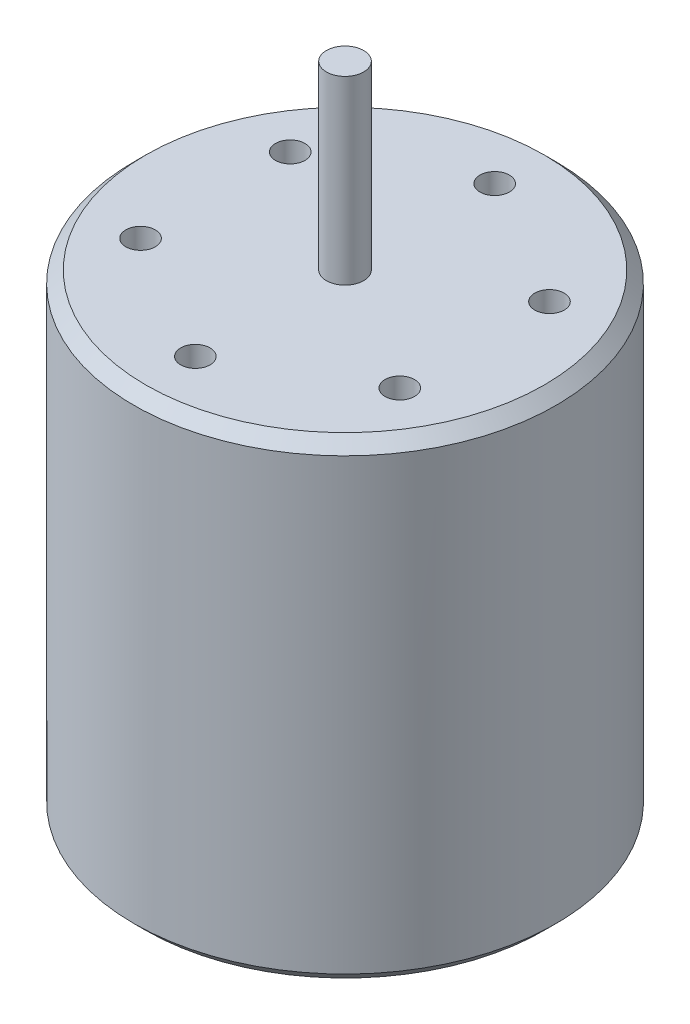
ISO-10303-21;
HEADER;
FILE_DESCRIPTION(('STEP AP214'),'2;1');
FILE_NAME('part.step','',(''),(''),'','','');
FILE_SCHEMA(('AUTOMOTIVE_DESIGN { 1 0 10303 214 1 1 1 1 }'));
ENDSEC;
DATA;
#1=APPLICATION_CONTEXT('core data for automotive mechanical design processes');
#2=APPLICATION_PROTOCOL_DEFINITION('international standard','automotive_design',2000,#1);
#3=PRODUCT_CONTEXT('',#1,'mechanical');
#4=PRODUCT('Part','Part','',(#3));
#5=PRODUCT_RELATED_PRODUCT_CATEGORY('part','',(#4));
#6=PRODUCT_DEFINITION_FORMATION('','',#4);
#7=PRODUCT_DEFINITION_CONTEXT('part definition',#1,'design');
#8=PRODUCT_DEFINITION('design','',#6,#7);
#9=PRODUCT_DEFINITION_SHAPE('','',#8);
#10=(LENGTH_UNIT() NAMED_UNIT(*) SI_UNIT(.MILLI.,.METRE.));
#11=(NAMED_UNIT(*) PLANE_ANGLE_UNIT() SI_UNIT($,.RADIAN.));
#12=(NAMED_UNIT(*) SI_UNIT($,.STERADIAN.) SOLID_ANGLE_UNIT());
#13=UNCERTAINTY_MEASURE_WITH_UNIT(LENGTH_MEASURE(1.E-05),#10,'distance_accuracy_value','');
#14=(GEOMETRIC_REPRESENTATION_CONTEXT(3) GLOBAL_UNCERTAINTY_ASSIGNED_CONTEXT((#13)) GLOBAL_UNIT_ASSIGNED_CONTEXT((#10,
#11,#12)) REPRESENTATION_CONTEXT('',''));
#15=CARTESIAN_POINT('',(0.,0.,0.));
#16=DIRECTION('',(0.,0.,1.));
#17=DIRECTION('',(1.,0.,0.));
#18=AXIS2_PLACEMENT_3D('',#15,#16,#17);
#19=CARTESIAN_POINT('',(0.,40.0812,0.));
#20=DIRECTION('',(0.,1.,0.));
#21=DIRECTION('',(0.,0.,1.));
#22=AXIS2_PLACEMENT_3D('',#19,#20,#21);
#23=PLANE('',#22);
#24=CARTESIAN_POINT('',(0.,40.0812,0.));
#25=DIRECTION('',(0.,1.,0.));
#26=DIRECTION('',(0.,0.,1.));
#27=AXIS2_PLACEMENT_3D('',#24,#25,#26);
#28=CIRCLE('',#27,16.907);
#29=CARTESIAN_POINT('',(0.,40.0812,16.907));
#30=VERTEX_POINT('',#29);
#31=EDGE_CURVE('E113',#30,#30,#28,.T.);
#32=ORIENTED_EDGE('',*,*,#31,.T.);
#33=EDGE_LOOP('',(#32));
#34=FACE_BOUND('',#33,.T.);
#35=CARTESIAN_POINT('',(-10.998522628062,40.0812,-6.34999999999938));
#36=DIRECTION('',(0.,1.,0.));
#37=DIRECTION('',(0.,0.,1.));
#38=AXIS2_PLACEMENT_3D('',#35,#36,#37);
#39=CIRCLE('',#38,1.25);
#40=CARTESIAN_POINT('',(-10.998522628062,40.0812,-5.09999999999938));
#41=VERTEX_POINT('',#40);
#42=EDGE_CURVE('E107',#41,#41,#39,.T.);
#43=ORIENTED_EDGE('',*,*,#42,.F.);
#44=EDGE_LOOP('',(#43));
#45=FACE_BOUND('',#44,.T.);
#46=CARTESIAN_POINT('',(-10.9985226280613,40.0812,6.35000000000063));
#47=DIRECTION('',(0.,1.,0.));
#48=DIRECTION('',(0.,0.,1.));
#49=AXIS2_PLACEMENT_3D('',#46,#47,#48);
#50=CIRCLE('',#49,1.25);
#51=CARTESIAN_POINT('',(-10.9985226280613,40.0812,7.60000000000063));
#52=VERTEX_POINT('',#51);
#53=EDGE_CURVE('E101',#52,#52,#50,.T.);
#54=ORIENTED_EDGE('',*,*,#53,.F.);
#55=EDGE_LOOP('',(#54));
#56=FACE_BOUND('',#55,.T.);
#57=CARTESIAN_POINT('',(1.44071223619469E-12,40.0812,12.7));
#58=DIRECTION('',(0.,1.,0.));
#59=DIRECTION('',(0.,0.,1.));
#60=AXIS2_PLACEMENT_3D('',#57,#58,#59);
#61=CIRCLE('',#60,1.25);
#62=CARTESIAN_POINT('',(1.44071223619469E-12,40.0812,13.95));
#63=VERTEX_POINT('',#62);
#64=EDGE_CURVE('E95',#63,#63,#61,.T.);
#65=ORIENTED_EDGE('',*,*,#64,.F.);
#66=EDGE_LOOP('',(#65));
#67=FACE_BOUND('',#66,.T.);
#68=CARTESIAN_POINT('',(10.9985226280635,40.0812,6.34999999999938));
#69=DIRECTION('',(0.,1.,0.));
#70=DIRECTION('',(0.,0.,1.));
#71=AXIS2_PLACEMENT_3D('',#68,#69,#70);
#72=CIRCLE('',#71,1.25);
#73=CARTESIAN_POINT('',(10.9985226280635,40.0812,7.59999999999937));
#74=VERTEX_POINT('',#73);
#75=EDGE_CURVE('E89',#74,#74,#72,.T.);
#76=ORIENTED_EDGE('',*,*,#75,.F.);
#77=EDGE_LOOP('',(#76));
#78=FACE_BOUND('',#77,.T.);
#79=CARTESIAN_POINT('',(10.9985226280627,40.0812,-6.35000000000062));
#80=DIRECTION('',(0.,1.,0.));
#81=DIRECTION('',(0.,0.,1.));
#82=AXIS2_PLACEMENT_3D('',#79,#80,#81);
#83=CIRCLE('',#82,1.25);
#84=CARTESIAN_POINT('',(10.9985226280627,40.0812,-5.10000000000062));
#85=VERTEX_POINT('',#84);
#86=EDGE_CURVE('E76',#85,#85,#83,.T.);
#87=ORIENTED_EDGE('',*,*,#86,.F.);
#88=EDGE_LOOP('',(#87));
#89=FACE_BOUND('',#88,.T.);
#90=CARTESIAN_POINT('',(0.,40.0812,-12.7));
#91=DIRECTION('',(0.,1.,0.));
#92=DIRECTION('',(0.,0.,1.));
#93=AXIS2_PLACEMENT_3D('',#90,#91,#92);
#94=CIRCLE('',#93,1.25);
#95=CARTESIAN_POINT('',(0.,40.0812,-11.45));
#96=VERTEX_POINT('',#95);
#97=EDGE_CURVE('E77',#96,#96,#94,.T.);
#98=ORIENTED_EDGE('',*,*,#97,.F.);
#99=EDGE_LOOP('',(#98));
#100=FACE_BOUND('',#99,.T.);
#101=CARTESIAN_POINT('',(0.,40.0812,0.));
#102=DIRECTION('',(0.,1.,0.));
#103=DIRECTION('',(0.,0.,1.));
#104=AXIS2_PLACEMENT_3D('',#101,#102,#103);
#105=CIRCLE('',#104,1.58);
#106=CARTESIAN_POINT('',(0.,40.0812,1.58));
#107=VERTEX_POINT('',#106);
#108=EDGE_CURVE('E147',#107,#107,#105,.T.);
#109=ORIENTED_EDGE('',*,*,#108,.F.);
#110=EDGE_LOOP('',(#109));
#111=FACE_BOUND('',#110,.T.);
#112=ADVANCED_FACE('F39',(#34,#45,#56,#67,#78,#89,#100,#111),#23,.T.);
#113=CARTESIAN_POINT('',(0.,40.0812,0.));
#114=DIRECTION('',(0.,-1.,0.));
#115=DIRECTION('',(0.,0.,-1.));
#116=AXIS2_PLACEMENT_3D('',#113,#114,#115);
#117=CYLINDRICAL_SURFACE('',#116,17.907);
#118=CARTESIAN_POINT('',(0.,39.0812,0.));
#119=DIRECTION('',(0.,1.,0.));
#120=DIRECTION('',(0.,0.,1.));
#121=AXIS2_PLACEMENT_3D('',#118,#119,#120);
#122=CIRCLE('',#121,17.907);
#123=CARTESIAN_POINT('',(0.,39.0812,-17.907));
#124=VERTEX_POINT('',#123);
#125=EDGE_CURVE('E47',#124,#124,#122,.F.);
#126=CARTESIAN_POINT('',(0.,1.00000000000003,0.));
#127=DIRECTION('',(0.,1.,0.));
#128=DIRECTION('',(0.,0.,1.));
#129=AXIS2_PLACEMENT_3D('',#126,#127,#128);
#130=CIRCLE('',#129,17.907);
#131=CARTESIAN_POINT('',(0.,1.00000000000002,-17.907));
#132=VERTEX_POINT('',#131);
#133=EDGE_CURVE('E116',#132,#132,#130,.T.);
#134=CARTESIAN_POINT('',(0.,39.0812,-17.907));
#135=CARTESIAN_POINT('',(0.,38.6845208333334,-17.907));
#136=CARTESIAN_POINT('',(0.,38.2878416666667,-17.907));
#137=CARTESIAN_POINT('',(0.,37.4944833333334,-17.907));
#138=CARTESIAN_POINT('',(0.,37.0978041666667,-17.907));
#139=CARTESIAN_POINT('',(0.,36.3044458333334,-17.907));
#140=CARTESIAN_POINT('',(0.,35.9077666666667,-17.907));
#141=CARTESIAN_POINT('',(0.,35.1144083333334,-17.907));
#142=CARTESIAN_POINT('',(0.,34.7177291666667,-17.907));
#143=CARTESIAN_POINT('',(0.,33.9243708333334,-17.907));
#144=CARTESIAN_POINT('',(0.,33.5276916666667,-17.907));
#145=CARTESIAN_POINT('',(0.,32.7343333333334,-17.907));
#146=CARTESIAN_POINT('',(0.,32.3376541666667,-17.907));
#147=CARTESIAN_POINT('',(0.,31.5442958333334,-17.907));
#148=CARTESIAN_POINT('',(0.,31.1476166666667,-17.907));
#149=CARTESIAN_POINT('',(0.,30.3542583333334,-17.907));
#150=CARTESIAN_POINT('',(0.,29.9575791666667,-17.907));
#151=CARTESIAN_POINT('',(0.,29.1642208333334,-17.907));
#152=CARTESIAN_POINT('',(0.,28.7675416666667,-17.907));
#153=CARTESIAN_POINT('',(0.,27.9741833333334,-17.907));
#154=CARTESIAN_POINT('',(0.,27.5775041666667,-17.907));
#155=CARTESIAN_POINT('',(0.,26.7841458333334,-17.907));
#156=CARTESIAN_POINT('',(0.,26.3874666666667,-17.907));
#157=CARTESIAN_POINT('',(0.,25.5941083333334,-17.907));
#158=CARTESIAN_POINT('',(0.,25.1974291666667,-17.907));
#159=CARTESIAN_POINT('',(0.,24.4040708333334,-17.907));
#160=CARTESIAN_POINT('',(0.,24.0073916666667,-17.907));
#161=CARTESIAN_POINT('',(0.,23.2140333333334,-17.907));
#162=CARTESIAN_POINT('',(0.,22.8173541666667,-17.907));
#163=CARTESIAN_POINT('',(0.,22.0239958333334,-17.907));
#164=CARTESIAN_POINT('',(0.,21.6273166666667,-17.907));
#165=CARTESIAN_POINT('',(0.,20.8339583333334,-17.907));
#166=CARTESIAN_POINT('',(0.,20.4372791666667,-17.907));
#167=CARTESIAN_POINT('',(0.,19.6439208333334,-17.907));
#168=CARTESIAN_POINT('',(0.,19.2472416666667,-17.907));
#169=CARTESIAN_POINT('',(0.,18.4538833333334,-17.907));
#170=CARTESIAN_POINT('',(0.,18.0572041666667,-17.907));
#171=CARTESIAN_POINT('',(0.,17.2638458333334,-17.907));
#172=CARTESIAN_POINT('',(0.,16.8671666666667,-17.907));
#173=CARTESIAN_POINT('',(0.,16.0738083333334,-17.907));
#174=CARTESIAN_POINT('',(0.,15.6771291666667,-17.907));
#175=CARTESIAN_POINT('',(0.,14.8837708333334,-17.907));
#176=CARTESIAN_POINT('',(0.,14.4870916666667,-17.907));
#177=CARTESIAN_POINT('',(0.,13.6937333333334,-17.907));
#178=CARTESIAN_POINT('',(0.,13.2970541666667,-17.907));
#179=CARTESIAN_POINT('',(0.,12.5036958333334,-17.907));
#180=CARTESIAN_POINT('',(0.,12.1070166666667,-17.907));
#181=CARTESIAN_POINT('',(0.,11.3136583333334,-17.907));
#182=CARTESIAN_POINT('',(0.,10.9169791666667,-17.907));
#183=CARTESIAN_POINT('',(0.,10.1236208333334,-17.907));
#184=CARTESIAN_POINT('',(0.,9.72694166666669,-17.907));
#185=CARTESIAN_POINT('',(0.,8.93358333333336,-17.907));
#186=CARTESIAN_POINT('',(0.,8.53690416666669,-17.907));
#187=CARTESIAN_POINT('',(0.,7.74354583333336,-17.907));
#188=CARTESIAN_POINT('',(0.,7.34686666666669,-17.907));
#189=CARTESIAN_POINT('',(0.,6.55350833333336,-17.907));
#190=CARTESIAN_POINT('',(0.,6.15682916666669,-17.907));
#191=CARTESIAN_POINT('',(0.,5.36347083333336,-17.907));
#192=CARTESIAN_POINT('',(0.,4.96679166666669,-17.907));
#193=CARTESIAN_POINT('',(0.,4.17343333333336,-17.907));
#194=CARTESIAN_POINT('',(0.,3.77675416666669,-17.907));
#195=CARTESIAN_POINT('',(0.,2.98339583333336,-17.907));
#196=CARTESIAN_POINT('',(0.,2.58671666666669,-17.907));
#197=CARTESIAN_POINT('',(0.,1.79335833333336,-17.907));
#198=CARTESIAN_POINT('',(0.,1.39667916666669,-17.907));
#199=CARTESIAN_POINT('',(0.,1.00000000000002,-17.907));
#200=B_SPLINE_CURVE_WITH_KNOTS('',3,(#134,#135,#136,#137,#138,#139,#140,#141,#142,#143,#144,
#145,#146,#147,#148,#149,#150,#151,#152,#153,#154,#155,#156,#157,#158,#159,#160,#161,#162,#163,
#164,#165,#166,#167,#168,#169,#170,#171,#172,#173,#174,#175,#176,#177,#178,#179,#180,#181,#182,
#183,#184,#185,#186,#187,#188,#189,#190,#191,#192,#193,#194,#195,#196,#197,#198,#199),
.UNSPECIFIED.,.F.,.F.,(4,2,2,2,2,2,2,2,2,2,2,2,2,2,2,2,2,2,2,2,2,2,2,2,2,2,2,2,2,2,2,2,4),(0.,
1.1900375,2.380075,3.57011250000001,4.76015,5.9501875,7.14022500000001,8.33026250000001,9.5203,
10.7103375,11.900375,13.0904125,14.28045,15.4704875,16.660525,17.8505625,19.0406,20.2306375,
21.420675,22.6107125,23.80075,24.9907875,26.180825,27.3708625,28.5609,29.7509375,30.940975,
32.1310125,33.32105,34.5110875,35.701125,36.8911625,38.0812),.UNSPECIFIED.);
#201=EDGE_CURVE('BSEAM121',#124,#132,#200,.T.);
#202=ORIENTED_EDGE('',*,*,#125,.T.);
#203=ORIENTED_EDGE('',*,*,#133,.T.);
#204=ORIENTED_EDGE('',*,*,#201,.T.);
#205=ORIENTED_EDGE('',*,*,#201,.F.);
#206=EDGE_LOOP('',(#202,#204,#203,#205));
#207=FACE_BOUND('',#206,.T.);
#208=ADVANCED_FACE('F121',(#207),#117,.T.);
#209=CARTESIAN_POINT('',(0.,0.,0.));
#210=DIRECTION('',(0.,1.,0.));
#211=DIRECTION('',(0.,0.,1.));
#212=AXIS2_PLACEMENT_3D('',#209,#210,#211);
#213=PLANE('',#212);
#214=CARTESIAN_POINT('',(0.,0.,0.));
#215=DIRECTION('',(0.,1.,0.));
#216=DIRECTION('',(0.,0.,1.));
#217=AXIS2_PLACEMENT_3D('',#214,#215,#216);
#218=CIRCLE('',#217,16.907);
#219=CARTESIAN_POINT('',(0.,0.,16.907));
#220=VERTEX_POINT('',#219);
#221=EDGE_CURVE('E11',#220,#220,#218,.F.);
#222=ORIENTED_EDGE('',*,*,#221,.T.);
#223=EDGE_LOOP('',(#222));
#224=FACE_BOUND('',#223,.T.);
#225=ADVANCED_FACE('F200',(#224),#213,.F.);
#226=CARTESIAN_POINT('',(-10.998522628062,35.0812,-6.34999999999938));
#227=DIRECTION('',(0.,1.,0.));
#228=DIRECTION('',(0.,0.,1.));
#229=AXIS2_PLACEMENT_3D('',#226,#227,#228);
#230=CONICAL_SURFACE('',#229,1.25,1.02974425867665);
#231=CARTESIAN_POINT('',(-10.998522628062,34.3301242262156,-6.34999999999938));
#232=VERTEX_POINT('',#231);
#233=VERTEX_LOOP('',#232);
#234=FACE_BOUND('',#233,.T.);
#235=CARTESIAN_POINT('',(-10.998522628062,35.0812,-6.34999999999938));
#236=DIRECTION('',(0.,1.,0.));
#237=DIRECTION('',(0.,0.,1.));
#238=AXIS2_PLACEMENT_3D('',#235,#236,#237);
#239=CIRCLE('',#238,1.25);
#240=CARTESIAN_POINT('',(-10.998522628062,35.0812,-5.09999999999938));
#241=VERTEX_POINT('',#240);
#242=EDGE_CURVE('E110',#241,#241,#239,.T.);
#243=ORIENTED_EDGE('',*,*,#242,.T.);
#244=EDGE_LOOP('',(#243));
#245=FACE_BOUND('',#244,.T.);
#246=ADVANCED_FACE('F197',(#234,#245),#230,.F.);
#247=CARTESIAN_POINT('',(-10.998522628062,40.0812,-6.34999999999938));
#248=DIRECTION('',(0.,1.,0.));
#249=DIRECTION('',(0.,0.,1.));
#250=AXIS2_PLACEMENT_3D('',#247,#248,#249);
#251=CYLINDRICAL_SURFACE('',#250,1.25);
#252=ORIENTED_EDGE('',*,*,#242,.F.);
#253=EDGE_LOOP('',(#252));
#254=FACE_BOUND('',#253,.T.);
#255=ORIENTED_EDGE('',*,*,#42,.T.);
#256=EDGE_LOOP('',(#255));
#257=FACE_BOUND('',#256,.T.);
#258=ADVANCED_FACE('F194',(#254,#257),#251,.F.);
#259=CARTESIAN_POINT('',(-10.9985226280613,35.0812,6.35000000000063));
#260=DIRECTION('',(0.,1.,0.));
#261=DIRECTION('',(0.,0.,1.));
#262=AXIS2_PLACEMENT_3D('',#259,#260,#261);
#263=CONICAL_SURFACE('',#262,1.25,1.02974425867665);
#264=CARTESIAN_POINT('',(-10.9985226280613,34.3301242262156,6.35000000000063));
#265=VERTEX_POINT('',#264);
#266=VERTEX_LOOP('',#265);
#267=FACE_BOUND('',#266,.T.);
#268=CARTESIAN_POINT('',(-10.9985226280613,35.0812,6.35000000000063));
#269=DIRECTION('',(0.,1.,0.));
#270=DIRECTION('',(0.,0.,1.));
#271=AXIS2_PLACEMENT_3D('',#268,#269,#270);
#272=CIRCLE('',#271,1.25);
#273=CARTESIAN_POINT('',(-10.9985226280613,35.0812,7.60000000000063));
#274=VERTEX_POINT('',#273);
#275=EDGE_CURVE('E104',#274,#274,#272,.T.);
#276=ORIENTED_EDGE('',*,*,#275,.T.);
#277=EDGE_LOOP('',(#276));
#278=FACE_BOUND('',#277,.T.);
#279=ADVANCED_FACE('F190',(#267,#278),#263,.F.);
#280=CARTESIAN_POINT('',(-10.9985226280613,40.0812,6.35000000000063));
#281=DIRECTION('',(0.,1.,0.));
#282=DIRECTION('',(0.,0.,1.));
#283=AXIS2_PLACEMENT_3D('',#280,#281,#282);
#284=CYLINDRICAL_SURFACE('',#283,1.25);
#285=ORIENTED_EDGE('',*,*,#275,.F.);
#286=EDGE_LOOP('',(#285));
#287=FACE_BOUND('',#286,.T.);
#288=ORIENTED_EDGE('',*,*,#53,.T.);
#289=EDGE_LOOP('',(#288));
#290=FACE_BOUND('',#289,.T.);
#291=ADVANCED_FACE('F186',(#287,#290),#284,.F.);
#292=CARTESIAN_POINT('',(1.44071223619469E-12,35.0812,12.7));
#293=DIRECTION('',(0.,1.,0.));
#294=DIRECTION('',(0.,0.,1.));
#295=AXIS2_PLACEMENT_3D('',#292,#293,#294);
#296=CONICAL_SURFACE('',#295,1.25,1.02974425867665);
#297=CARTESIAN_POINT('',(1.43930362888709E-12,34.3301242262156,12.7));
#298=VERTEX_POINT('',#297);
#299=VERTEX_LOOP('',#298);
#300=FACE_BOUND('',#299,.T.);
#301=CARTESIAN_POINT('',(1.44071223619469E-12,35.0812,12.7));
#302=DIRECTION('',(0.,1.,0.));
#303=DIRECTION('',(0.,0.,1.));
#304=AXIS2_PLACEMENT_3D('',#301,#302,#303);
#305=CIRCLE('',#304,1.25);
#306=CARTESIAN_POINT('',(1.44071223619469E-12,35.0812,13.95));
#307=VERTEX_POINT('',#306);
#308=EDGE_CURVE('E98',#307,#307,#305,.T.);
#309=ORIENTED_EDGE('',*,*,#308,.T.);
#310=EDGE_LOOP('',(#309));
#311=FACE_BOUND('',#310,.T.);
#312=ADVANCED_FACE('F182',(#300,#311),#296,.F.);
#313=CARTESIAN_POINT('',(1.44071223619469E-12,40.0812,12.7));
#314=DIRECTION('',(0.,1.,0.));
#315=DIRECTION('',(0.,0.,1.));
#316=AXIS2_PLACEMENT_3D('',#313,#314,#315);
#317=CYLINDRICAL_SURFACE('',#316,1.25);
#318=ORIENTED_EDGE('',*,*,#308,.F.);
#319=EDGE_LOOP('',(#318));
#320=FACE_BOUND('',#319,.T.);
#321=ORIENTED_EDGE('',*,*,#64,.T.);
#322=EDGE_LOOP('',(#321));
#323=FACE_BOUND('',#322,.T.);
#324=ADVANCED_FACE('F178',(#320,#323),#317,.F.);
#325=CARTESIAN_POINT('',(10.9985226280635,35.0812,6.34999999999938));
#326=DIRECTION('',(0.,1.,0.));
#327=DIRECTION('',(0.,0.,1.));
#328=AXIS2_PLACEMENT_3D('',#325,#326,#327);
#329=CONICAL_SURFACE('',#328,1.25,1.02974425867665);
#330=CARTESIAN_POINT('',(10.9985226280634,34.3301242262156,6.34999999999938));
#331=VERTEX_POINT('',#330);
#332=VERTEX_LOOP('',#331);
#333=FACE_BOUND('',#332,.T.);
#334=CARTESIAN_POINT('',(10.9985226280635,35.0812,6.34999999999938));
#335=DIRECTION('',(0.,1.,0.));
#336=DIRECTION('',(0.,0.,1.));
#337=AXIS2_PLACEMENT_3D('',#334,#335,#336);
#338=CIRCLE('',#337,1.25);
#339=CARTESIAN_POINT('',(10.9985226280635,35.0812,7.59999999999937));
#340=VERTEX_POINT('',#339);
#341=EDGE_CURVE('E92',#340,#340,#338,.T.);
#342=ORIENTED_EDGE('',*,*,#341,.T.);
#343=EDGE_LOOP('',(#342));
#344=FACE_BOUND('',#343,.T.);
#345=ADVANCED_FACE('F174',(#333,#344),#329,.F.);
#346=CARTESIAN_POINT('',(10.9985226280635,40.0812,6.34999999999938));
#347=DIRECTION('',(0.,1.,0.));
#348=DIRECTION('',(0.,0.,1.));
#349=AXIS2_PLACEMENT_3D('',#346,#347,#348);
#350=CYLINDRICAL_SURFACE('',#349,1.25);
#351=ORIENTED_EDGE('',*,*,#341,.F.);
#352=EDGE_LOOP('',(#351));
#353=FACE_BOUND('',#352,.T.);
#354=ORIENTED_EDGE('',*,*,#75,.T.);
#355=EDGE_LOOP('',(#354));
#356=FACE_BOUND('',#355,.T.);
#357=ADVANCED_FACE('F170',(#353,#356),#350,.F.);
#358=CARTESIAN_POINT('',(10.9985226280627,35.0812,-6.35000000000062));
#359=DIRECTION('',(0.,1.,0.));
#360=DIRECTION('',(0.,0.,1.));
#361=AXIS2_PLACEMENT_3D('',#358,#359,#360);
#362=CONICAL_SURFACE('',#361,1.25,1.02974425867665);
#363=CARTESIAN_POINT('',(10.9985226280627,34.3301242262156,-6.35000000000062));
#364=VERTEX_POINT('',#363);
#365=VERTEX_LOOP('',#364);
#366=FACE_BOUND('',#365,.T.);
#367=CARTESIAN_POINT('',(10.9985226280627,35.0812,-6.35000000000062));
#368=DIRECTION('',(0.,1.,0.));
#369=DIRECTION('',(0.,0.,1.));
#370=AXIS2_PLACEMENT_3D('',#367,#368,#369);
#371=CIRCLE('',#370,1.25);
#372=CARTESIAN_POINT('',(10.9985226280627,35.0812,-5.10000000000062));
#373=VERTEX_POINT('',#372);
#374=EDGE_CURVE('E80',#373,#373,#371,.T.);
#375=ORIENTED_EDGE('',*,*,#374,.T.);
#376=EDGE_LOOP('',(#375));
#377=FACE_BOUND('',#376,.T.);
#378=ADVANCED_FACE('F166',(#366,#377),#362,.F.);
#379=CARTESIAN_POINT('',(10.9985226280627,40.0812,-6.35000000000062));
#380=DIRECTION('',(0.,1.,0.));
#381=DIRECTION('',(0.,0.,1.));
#382=AXIS2_PLACEMENT_3D('',#379,#380,#381);
#383=CYLINDRICAL_SURFACE('',#382,1.25);
#384=ORIENTED_EDGE('',*,*,#374,.F.);
#385=EDGE_LOOP('',(#384));
#386=FACE_BOUND('',#385,.T.);
#387=ORIENTED_EDGE('',*,*,#86,.T.);
#388=EDGE_LOOP('',(#387));
#389=FACE_BOUND('',#388,.T.);
#390=ADVANCED_FACE('F70',(#386,#389),#383,.F.);
#391=CARTESIAN_POINT('',(0.,35.0812,-12.7));
#392=DIRECTION('',(0.,1.,0.));
#393=DIRECTION('',(0.,0.,1.));
#394=AXIS2_PLACEMENT_3D('',#391,#392,#393);
#395=CONICAL_SURFACE('',#394,1.25,1.02974425867665);
#396=CARTESIAN_POINT('',(0.,34.3301242262156,-12.7));
#397=VERTEX_POINT('',#396);
#398=VERTEX_LOOP('',#397);
#399=FACE_BOUND('',#398,.T.);
#400=CARTESIAN_POINT('',(0.,35.0812,-12.7));
#401=DIRECTION('',(0.,1.,0.));
#402=DIRECTION('',(0.,0.,1.));
#403=AXIS2_PLACEMENT_3D('',#400,#401,#402);
#404=CIRCLE('',#403,1.25);
#405=CARTESIAN_POINT('',(0.,35.0812,-11.45));
#406=VERTEX_POINT('',#405);
#407=EDGE_CURVE('E74',#406,#406,#404,.T.);
#408=ORIENTED_EDGE('',*,*,#407,.T.);
#409=EDGE_LOOP('',(#408));
#410=FACE_BOUND('',#409,.T.);
#411=ADVANCED_FACE('F66',(#399,#410),#395,.F.);
#412=CARTESIAN_POINT('',(0.,40.0812,-12.7));
#413=DIRECTION('',(0.,1.,0.));
#414=DIRECTION('',(0.,0.,1.));
#415=AXIS2_PLACEMENT_3D('',#412,#413,#414);
#416=CYLINDRICAL_SURFACE('',#415,1.25);
#417=ORIENTED_EDGE('',*,*,#407,.F.);
#418=EDGE_LOOP('',(#417));
#419=FACE_BOUND('',#418,.T.);
#420=ORIENTED_EDGE('',*,*,#97,.T.);
#421=EDGE_LOOP('',(#420));
#422=FACE_BOUND('',#421,.T.);
#423=ADVANCED_FACE('F69',(#419,#422),#416,.F.);
#424=CARTESIAN_POINT('',(0.,55.4228,0.));
#425=DIRECTION('',(0.,-1.,0.));
#426=DIRECTION('',(0.,0.,-1.));
#427=AXIS2_PLACEMENT_3D('',#424,#425,#426);
#428=CYLINDRICAL_SURFACE('',#427,1.58);
#429=CARTESIAN_POINT('',(0.,55.4228,0.));
#430=DIRECTION('',(0.,1.,0.));
#431=DIRECTION('',(0.,0.,1.));
#432=AXIS2_PLACEMENT_3D('',#429,#430,#431);
#433=CIRCLE('',#432,1.58);
#434=CARTESIAN_POINT('',(0.,55.4228,1.58));
#435=VERTEX_POINT('',#434);
#436=EDGE_CURVE('E83',#435,#435,#433,.T.);
#437=ORIENTED_EDGE('',*,*,#436,.F.);
#438=EDGE_LOOP('',(#437));
#439=FACE_BOUND('',#438,.T.);
#440=ORIENTED_EDGE('',*,*,#108,.T.);
#441=EDGE_LOOP('',(#440));
#442=FACE_BOUND('',#441,.T.);
#443=ADVANCED_FACE('F154',(#439,#442),#428,.T.);
#444=CARTESIAN_POINT('',(0.,55.4228,0.));
#445=DIRECTION('',(0.,1.,0.));
#446=DIRECTION('',(0.,0.,1.));
#447=AXIS2_PLACEMENT_3D('',#444,#445,#446);
#448=PLANE('',#447);
#449=ORIENTED_EDGE('',*,*,#436,.T.);
#450=EDGE_LOOP('',(#449));
#451=FACE_BOUND('',#450,.T.);
#452=ADVANCED_FACE('F127',(#451),#448,.T.);
#453=CARTESIAN_POINT('',(0.,40.0812,0.));
#454=DIRECTION('',(0.,-1.,0.));
#455=DIRECTION('',(0.,0.,-1.));
#456=AXIS2_PLACEMENT_3D('',#453,#454,#455);
#457=CONICAL_SURFACE('',#456,16.907,0.785398163397447);
#458=ORIENTED_EDGE('',*,*,#125,.F.);
#459=EDGE_LOOP('',(#458));
#460=FACE_BOUND('',#459,.T.);
#461=ORIENTED_EDGE('',*,*,#31,.F.);
#462=EDGE_LOOP('',(#461));
#463=FACE_BOUND('',#462,.T.);
#464=ADVANCED_FACE('F124',(#460,#463),#457,.T.);
#465=CARTESIAN_POINT('',(0.,1.00000000000003,0.));
#466=DIRECTION('',(0.,1.,0.));
#467=DIRECTION('',(0.,0.,1.));
#468=AXIS2_PLACEMENT_3D('',#465,#466,#467);
#469=CONICAL_SURFACE('',#468,17.907,0.785398163397454);
#470=ORIENTED_EDGE('',*,*,#221,.F.);
#471=EDGE_LOOP('',(#470));
#472=FACE_BOUND('',#471,.T.);
#473=ORIENTED_EDGE('',*,*,#133,.F.);
#474=EDGE_LOOP('',(#473));
#475=FACE_BOUND('',#474,.T.);
#476=ADVANCED_FACE('F41',(#472,#475),#469,.T.);
#477=CLOSED_SHELL('',(#112,#208,#225,#246,#258,#279,#291,#312,#324,#345,#357,#378,#390,#411,
#423,#443,#452,#464,#476));
#478=MANIFOLD_SOLID_BREP('B2',#477);
#479=ADVANCED_BREP_SHAPE_REPRESENTATION('',(#18,#478),#14);
#480=SHAPE_DEFINITION_REPRESENTATION(#9,#479);
ENDSEC;
END-ISO-10303-21;
